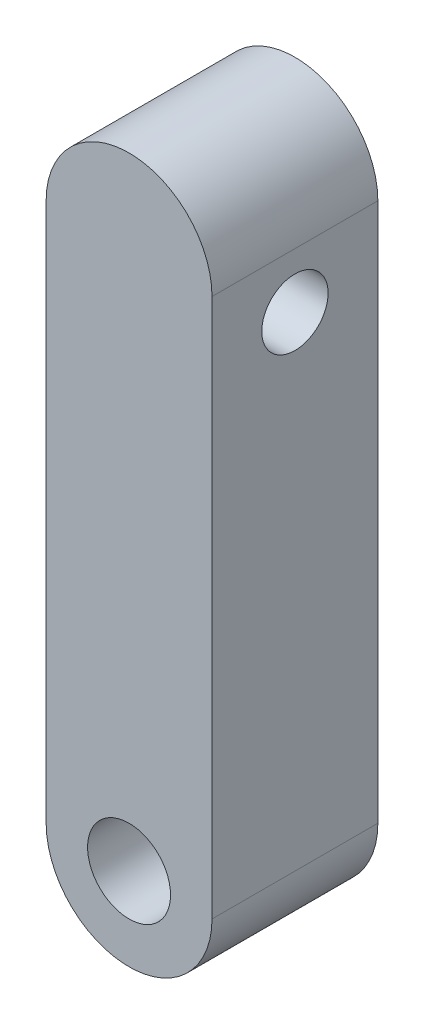
ISO-10303-21;
HEADER;
FILE_DESCRIPTION(('STEP AP214'),'2;1');
FILE_NAME('part.step','',(''),(''),'','','');
FILE_SCHEMA(('AUTOMOTIVE_DESIGN { 1 0 10303 214 1 1 1 1 }'));
ENDSEC;
DATA;
#1=APPLICATION_CONTEXT('core data for automotive mechanical design processes');
#2=APPLICATION_PROTOCOL_DEFINITION('international standard','automotive_design',2000,#1);
#3=PRODUCT_CONTEXT('',#1,'mechanical');
#4=PRODUCT('Part','Part','',(#3));
#5=PRODUCT_RELATED_PRODUCT_CATEGORY('part','',(#4));
#6=PRODUCT_DEFINITION_FORMATION('','',#4);
#7=PRODUCT_DEFINITION_CONTEXT('part definition',#1,'design');
#8=PRODUCT_DEFINITION('design','',#6,#7);
#9=PRODUCT_DEFINITION_SHAPE('','',#8);
#10=(LENGTH_UNIT() NAMED_UNIT(*) SI_UNIT(.MILLI.,.METRE.));
#11=(NAMED_UNIT(*) PLANE_ANGLE_UNIT() SI_UNIT($,.RADIAN.));
#12=(NAMED_UNIT(*) SI_UNIT($,.STERADIAN.) SOLID_ANGLE_UNIT());
#13=UNCERTAINTY_MEASURE_WITH_UNIT(LENGTH_MEASURE(1.E-05),#10,'distance_accuracy_value','');
#14=(GEOMETRIC_REPRESENTATION_CONTEXT(3) GLOBAL_UNCERTAINTY_ASSIGNED_CONTEXT((#13)) GLOBAL_UNIT_ASSIGNED_CONTEXT((#10,
#11,#12)) REPRESENTATION_CONTEXT('',''));
#15=CARTESIAN_POINT('',(0.,0.,0.));
#16=DIRECTION('',(0.,0.,1.));
#17=DIRECTION('',(1.,0.,0.));
#18=AXIS2_PLACEMENT_3D('',#15,#16,#17);
#19=CARTESIAN_POINT('',(0.,0.,20.));
#20=DIRECTION('',(0.,0.,1.));
#21=DIRECTION('',(1.,0.,0.));
#22=AXIS2_PLACEMENT_3D('',#19,#20,#21);
#23=PLANE('',#22);
#24=CARTESIAN_POINT('',(0.,0.,20.));
#25=DIRECTION('',(0.,0.,1.));
#26=DIRECTION('',(1.,0.,0.));
#27=AXIS2_PLACEMENT_3D('',#24,#25,#26);
#28=CIRCLE('',#27,10.);
#29=CARTESIAN_POINT('',(-10.,0.,20.));
#30=VERTEX_POINT('',#29);
#31=CARTESIAN_POINT('',(10.,0.,20.));
#32=VERTEX_POINT('',#31);
#33=EDGE_CURVE('E101',#30,#32,#28,.T.);
#34=ORIENTED_EDGE('',*,*,#33,.T.);
#35=DIRECTION('',(0.,1.,0.));
#36=VECTOR('',#35,1.);
#37=CARTESIAN_POINT('',(10.,0.,20.));
#38=LINE('',#37,#36);
#39=CARTESIAN_POINT('',(10.,65.,20.));
#40=VERTEX_POINT('',#39);
#41=EDGE_CURVE('E96',#32,#40,#38,.T.);
#42=ORIENTED_EDGE('',*,*,#41,.T.);
#43=CARTESIAN_POINT('',(0.,65.,20.));
#44=DIRECTION('',(0.,0.,1.));
#45=DIRECTION('',(1.,0.,0.));
#46=AXIS2_PLACEMENT_3D('',#43,#44,#45);
#47=CIRCLE('',#46,10.);
#48=CARTESIAN_POINT('',(-10.,65.,20.));
#49=VERTEX_POINT('',#48);
#50=EDGE_CURVE('E99',#40,#49,#47,.T.);
#51=ORIENTED_EDGE('',*,*,#50,.T.);
#52=DIRECTION('',(0.,-1.,0.));
#53=VECTOR('',#52,1.);
#54=CARTESIAN_POINT('',(-10.,0.,20.));
#55=LINE('',#54,#53);
#56=EDGE_CURVE('E66',#49,#30,#55,.T.);
#57=ORIENTED_EDGE('',*,*,#56,.T.);
#58=EDGE_LOOP('',(#34,#42,#51,#57));
#59=FACE_BOUND('',#58,.T.);
#60=CARTESIAN_POINT('',(0.,0.,20.));
#61=DIRECTION('',(0.,0.,1.));
#62=DIRECTION('',(1.,0.,0.));
#63=AXIS2_PLACEMENT_3D('',#60,#61,#62);
#64=CIRCLE('',#63,5.);
#65=CARTESIAN_POINT('',(5.,0.,20.));
#66=VERTEX_POINT('',#65);
#67=EDGE_CURVE('E117',#66,#66,#64,.T.);
#68=ORIENTED_EDGE('',*,*,#67,.F.);
#69=EDGE_LOOP('',(#68));
#70=FACE_BOUND('',#69,.T.);
#71=ADVANCED_FACE('F48',(#59,#70),#23,.T.);
#72=CARTESIAN_POINT('',(0.,0.,0.));
#73=DIRECTION('',(0.,0.,1.));
#74=DIRECTION('',(1.,0.,0.));
#75=AXIS2_PLACEMENT_3D('',#72,#73,#74);
#76=PLANE('',#75);
#77=CARTESIAN_POINT('',(0.,0.,0.));
#78=DIRECTION('',(0.,0.,1.));
#79=DIRECTION('',(1.,0.,0.));
#80=AXIS2_PLACEMENT_3D('',#77,#78,#79);
#81=CIRCLE('',#80,10.);
#82=CARTESIAN_POINT('',(-10.,0.,0.));
#83=VERTEX_POINT('',#82);
#84=CARTESIAN_POINT('',(10.,0.,0.));
#85=VERTEX_POINT('',#84);
#86=EDGE_CURVE('E114',#83,#85,#81,.T.);
#87=ORIENTED_EDGE('',*,*,#86,.F.);
#88=DIRECTION('',(0.,-1.,0.));
#89=VECTOR('',#88,1.);
#90=CARTESIAN_POINT('',(-10.,0.,0.));
#91=LINE('',#90,#89);
#92=CARTESIAN_POINT('',(-10.,65.,0.));
#93=VERTEX_POINT('',#92);
#94=EDGE_CURVE('E89',#93,#83,#91,.T.);
#95=ORIENTED_EDGE('',*,*,#94,.F.);
#96=CARTESIAN_POINT('',(0.,65.,0.));
#97=DIRECTION('',(0.,0.,1.));
#98=DIRECTION('',(1.,0.,0.));
#99=AXIS2_PLACEMENT_3D('',#96,#97,#98);
#100=CIRCLE('',#99,10.);
#101=CARTESIAN_POINT('',(10.,65.,0.));
#102=VERTEX_POINT('',#101);
#103=EDGE_CURVE('E83',#102,#93,#100,.T.);
#104=ORIENTED_EDGE('',*,*,#103,.F.);
#105=DIRECTION('',(0.,1.,0.));
#106=VECTOR('',#105,1.);
#107=CARTESIAN_POINT('',(10.,0.,0.));
#108=LINE('',#107,#106);
#109=EDGE_CURVE('E105',#85,#102,#108,.T.);
#110=ORIENTED_EDGE('',*,*,#109,.F.);
#111=EDGE_LOOP('',(#87,#95,#104,#110));
#112=FACE_BOUND('',#111,.T.);
#113=CARTESIAN_POINT('',(0.,0.,0.));
#114=DIRECTION('',(0.,0.,1.));
#115=DIRECTION('',(1.,0.,0.));
#116=AXIS2_PLACEMENT_3D('',#113,#114,#115);
#117=CIRCLE('',#116,5.);
#118=CARTESIAN_POINT('',(5.,0.,0.));
#119=VERTEX_POINT('',#118);
#120=EDGE_CURVE('E129',#119,#119,#117,.T.);
#121=ORIENTED_EDGE('',*,*,#120,.T.);
#122=EDGE_LOOP('',(#121));
#123=FACE_BOUND('',#122,.T.);
#124=ADVANCED_FACE('F125',(#112,#123),#76,.F.);
#125=CARTESIAN_POINT('',(0.,0.,20.));
#126=DIRECTION('',(0.,0.,-1.));
#127=DIRECTION('',(-1.,0.,0.));
#128=AXIS2_PLACEMENT_3D('',#125,#126,#127);
#129=CYLINDRICAL_SURFACE('',#128,10.);
#130=ORIENTED_EDGE('',*,*,#86,.T.);
#131=DIRECTION('',(0.,0.,-1.));
#132=VECTOR('',#131,1.);
#133=CARTESIAN_POINT('',(10.,0.,20.));
#134=LINE('',#133,#132);
#135=EDGE_CURVE('E13',#32,#85,#134,.T.);
#136=ORIENTED_EDGE('',*,*,#135,.F.);
#137=ORIENTED_EDGE('',*,*,#33,.F.);
#138=DIRECTION('',(0.,0.,-1.));
#139=VECTOR('',#138,1.);
#140=CARTESIAN_POINT('',(-10.,0.,20.));
#141=LINE('',#140,#139);
#142=EDGE_CURVE('E110',#30,#83,#141,.T.);
#143=ORIENTED_EDGE('',*,*,#142,.T.);
#144=EDGE_LOOP('',(#130,#136,#137,#143));
#145=FACE_BOUND('',#144,.T.);
#146=ADVANCED_FACE('F50',(#145),#129,.T.);
#147=CARTESIAN_POINT('',(10.,0.,20.));
#148=DIRECTION('',(-1.,0.,0.));
#149=DIRECTION('',(0.,0.,1.));
#150=AXIS2_PLACEMENT_3D('',#147,#148,#149);
#151=PLANE('',#150);
#152=CARTESIAN_POINT('',(10.,58.36,10.));
#153=DIRECTION('',(1.,0.,0.));
#154=DIRECTION('',(0.,0.,-1.));
#155=AXIS2_PLACEMENT_3D('',#152,#153,#154);
#156=CIRCLE('',#155,4.);
#157=CARTESIAN_POINT('',(10.,58.36,6.));
#158=VERTEX_POINT('',#157);
#159=EDGE_CURVE('E134',#158,#158,#156,.T.);
#160=ORIENTED_EDGE('',*,*,#159,.F.);
#161=EDGE_LOOP('',(#160));
#162=FACE_BOUND('',#161,.T.);
#163=ORIENTED_EDGE('',*,*,#109,.T.);
#164=DIRECTION('',(0.,0.,-1.));
#165=VECTOR('',#164,1.);
#166=CARTESIAN_POINT('',(10.,65.,20.));
#167=LINE('',#166,#165);
#168=EDGE_CURVE('E58',#40,#102,#167,.T.);
#169=ORIENTED_EDGE('',*,*,#168,.F.);
#170=ORIENTED_EDGE('',*,*,#41,.F.);
#171=ORIENTED_EDGE('',*,*,#135,.T.);
#172=EDGE_LOOP('',(#163,#169,#170,#171));
#173=FACE_BOUND('',#172,.T.);
#174=ADVANCED_FACE('F104',(#162,#173),#151,.F.);
#175=CARTESIAN_POINT('',(0.,65.,20.));
#176=DIRECTION('',(0.,0.,-1.));
#177=DIRECTION('',(-1.,0.,0.));
#178=AXIS2_PLACEMENT_3D('',#175,#176,#177);
#179=CYLINDRICAL_SURFACE('',#178,10.);
#180=ORIENTED_EDGE('',*,*,#103,.T.);
#181=DIRECTION('',(0.,0.,-1.));
#182=VECTOR('',#181,1.);
#183=CARTESIAN_POINT('',(-10.,65.,20.));
#184=LINE('',#183,#182);
#185=EDGE_CURVE('E106',#49,#93,#184,.T.);
#186=ORIENTED_EDGE('',*,*,#185,.F.);
#187=ORIENTED_EDGE('',*,*,#50,.F.);
#188=ORIENTED_EDGE('',*,*,#168,.T.);
#189=EDGE_LOOP('',(#180,#186,#187,#188));
#190=FACE_BOUND('',#189,.T.);
#191=ADVANCED_FACE('F108',(#190),#179,.T.);
#192=CARTESIAN_POINT('',(-10.,0.,20.));
#193=DIRECTION('',(1.,0.,0.));
#194=DIRECTION('',(0.,0.,-1.));
#195=AXIS2_PLACEMENT_3D('',#192,#193,#194);
#196=PLANE('',#195);
#197=CARTESIAN_POINT('',(-10.,58.36,10.));
#198=DIRECTION('',(1.,0.,0.));
#199=DIRECTION('',(0.,0.,-1.));
#200=AXIS2_PLACEMENT_3D('',#197,#198,#199);
#201=CIRCLE('',#200,4.);
#202=CARTESIAN_POINT('',(-10.,58.36,6.));
#203=VERTEX_POINT('',#202);
#204=EDGE_CURVE('E52',#203,#203,#201,.T.);
#205=ORIENTED_EDGE('',*,*,#204,.T.);
#206=EDGE_LOOP('',(#205));
#207=FACE_BOUND('',#206,.T.);
#208=ORIENTED_EDGE('',*,*,#94,.T.);
#209=ORIENTED_EDGE('',*,*,#142,.F.);
#210=ORIENTED_EDGE('',*,*,#56,.F.);
#211=ORIENTED_EDGE('',*,*,#185,.T.);
#212=EDGE_LOOP('',(#208,#209,#210,#211));
#213=FACE_BOUND('',#212,.T.);
#214=ADVANCED_FACE('F122',(#207,#213),#196,.F.);
#215=CARTESIAN_POINT('',(0.,0.,20.));
#216=DIRECTION('',(0.,0.,-1.));
#217=DIRECTION('',(-1.,0.,0.));
#218=AXIS2_PLACEMENT_3D('',#215,#216,#217);
#219=CYLINDRICAL_SURFACE('',#218,5.);
#220=ORIENTED_EDGE('',*,*,#67,.T.);
#221=EDGE_LOOP('',(#220));
#222=FACE_BOUND('',#221,.T.);
#223=ORIENTED_EDGE('',*,*,#120,.F.);
#224=EDGE_LOOP('',(#223));
#225=FACE_BOUND('',#224,.T.);
#226=ADVANCED_FACE('F144',(#222,#225),#219,.F.);
#227=CARTESIAN_POINT('',(-45.,58.36,10.));
#228=DIRECTION('',(1.,0.,0.));
#229=DIRECTION('',(0.,0.,-1.));
#230=AXIS2_PLACEMENT_3D('',#227,#228,#229);
#231=CYLINDRICAL_SURFACE('',#230,4.);
#232=ORIENTED_EDGE('',*,*,#159,.T.);
#233=EDGE_LOOP('',(#232));
#234=FACE_BOUND('',#233,.T.);
#235=ORIENTED_EDGE('',*,*,#204,.F.);
#236=EDGE_LOOP('',(#235));
#237=FACE_BOUND('',#236,.T.);
#238=ADVANCED_FACE('F142',(#234,#237),#231,.F.);
#239=CLOSED_SHELL('',(#71,#124,#146,#174,#191,#214,#226,#238));
#240=MANIFOLD_SOLID_BREP('B2',#239);
#241=ADVANCED_BREP_SHAPE_REPRESENTATION('',(#18,#240),#14);
#242=SHAPE_DEFINITION_REPRESENTATION(#9,#241);
ENDSEC;
END-ISO-10303-21;
